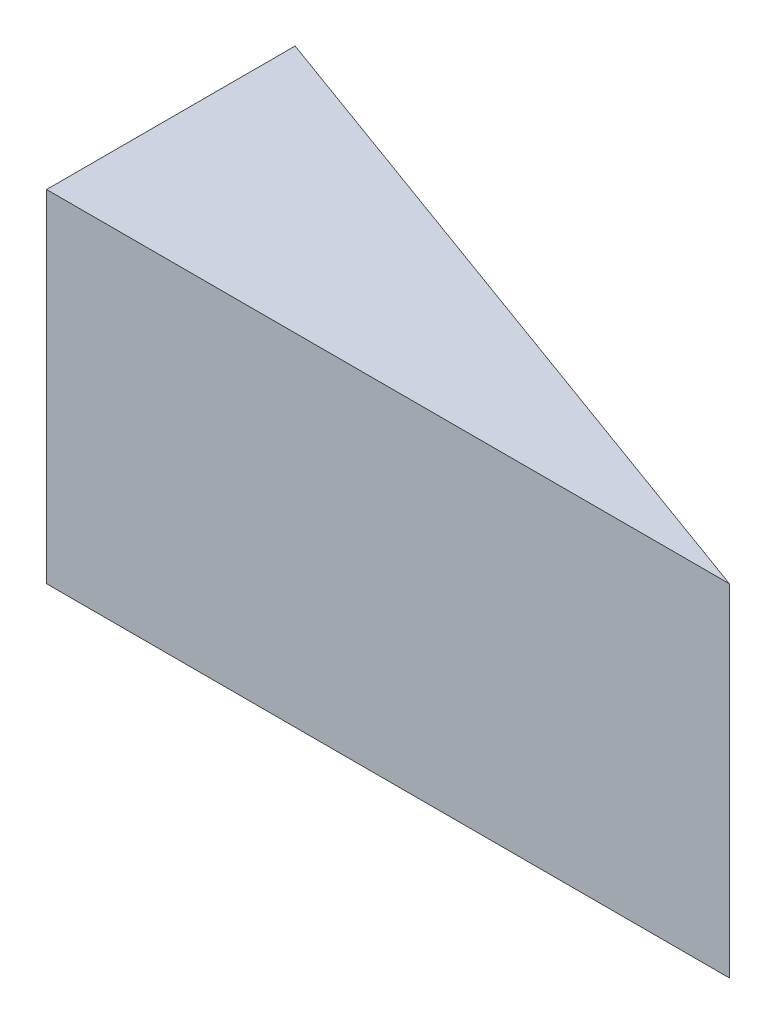
ISO-10303-21;
HEADER;
FILE_DESCRIPTION(('STEP AP214'),'2;1');
FILE_NAME('part.step','',(''),(''),'','','');
FILE_SCHEMA(('AUTOMOTIVE_DESIGN { 1 0 10303 214 1 1 1 1 }'));
ENDSEC;
DATA;
#1=APPLICATION_CONTEXT('core data for automotive mechanical design processes');
#2=APPLICATION_PROTOCOL_DEFINITION('international standard','automotive_design',2000,#1);
#3=PRODUCT_CONTEXT('',#1,'mechanical');
#4=PRODUCT('Part','Part','',(#3));
#5=PRODUCT_RELATED_PRODUCT_CATEGORY('part','',(#4));
#6=PRODUCT_DEFINITION_FORMATION('','',#4);
#7=PRODUCT_DEFINITION_CONTEXT('part definition',#1,'design');
#8=PRODUCT_DEFINITION('design','',#6,#7);
#9=PRODUCT_DEFINITION_SHAPE('','',#8);
#10=(LENGTH_UNIT() NAMED_UNIT(*) SI_UNIT(.MILLI.,.METRE.));
#11=(NAMED_UNIT(*) PLANE_ANGLE_UNIT() SI_UNIT($,.RADIAN.));
#12=(NAMED_UNIT(*) SI_UNIT($,.STERADIAN.) SOLID_ANGLE_UNIT());
#13=UNCERTAINTY_MEASURE_WITH_UNIT(LENGTH_MEASURE(1.E-05),#10,'distance_accuracy_value','');
#14=(GEOMETRIC_REPRESENTATION_CONTEXT(3) GLOBAL_UNCERTAINTY_ASSIGNED_CONTEXT((#13)) GLOBAL_UNIT_ASSIGNED_CONTEXT((#10,
#11,#12)) REPRESENTATION_CONTEXT('',''));
#15=CARTESIAN_POINT('',(0.,0.,0.));
#16=DIRECTION('',(0.,0.,1.));
#17=DIRECTION('',(1.,0.,0.));
#18=AXIS2_PLACEMENT_3D('',#15,#16,#17);
#19=CARTESIAN_POINT('',(0.,20.,-14.5588093706478));
#20=DIRECTION('',(1.,0.,0.));
#21=DIRECTION('',(0.,0.,-1.));
#22=AXIS2_PLACEMENT_3D('',#19,#20,#21);
#23=PLANE('',#22);
#24=DIRECTION('',(0.,0.,1.));
#25=VECTOR('',#24,1.);
#26=CARTESIAN_POINT('',(0.,0.,-14.5588093706478));
#27=LINE('',#26,#25);
#28=CARTESIAN_POINT('',(0.,0.,-14.5588093706478));
#29=VERTEX_POINT('',#28);
#30=CARTESIAN_POINT('',(0.,0.,0.));
#31=VERTEX_POINT('',#30);
#32=EDGE_CURVE('E89',#29,#31,#27,.T.);
#33=ORIENTED_EDGE('',*,*,#32,.T.);
#34=DIRECTION('',(0.,-1.,0.));
#35=VECTOR('',#34,1.);
#36=CARTESIAN_POINT('',(0.,20.,0.));
#37=LINE('',#36,#35);
#38=CARTESIAN_POINT('',(0.,20.,0.));
#39=VERTEX_POINT('',#38);
#40=EDGE_CURVE('E11',#39,#31,#37,.T.);
#41=ORIENTED_EDGE('',*,*,#40,.F.);
#42=DIRECTION('',(0.,0.,1.));
#43=VECTOR('',#42,1.);
#44=CARTESIAN_POINT('',(0.,20.,-14.5588093706478));
#45=LINE('',#44,#43);
#46=CARTESIAN_POINT('',(0.,20.,-14.5588093706478));
#47=VERTEX_POINT('',#46);
#48=EDGE_CURVE('E81',#47,#39,#45,.T.);
#49=ORIENTED_EDGE('',*,*,#48,.F.);
#50=DIRECTION('',(0.,-1.,0.));
#51=VECTOR('',#50,1.);
#52=CARTESIAN_POINT('',(0.,20.,-14.5588093706478));
#53=LINE('',#52,#51);
#54=EDGE_CURVE('E90',#47,#29,#53,.T.);
#55=ORIENTED_EDGE('',*,*,#54,.T.);
#56=EDGE_LOOP('',(#33,#41,#49,#55));
#57=FACE_BOUND('',#56,.T.);
#58=ADVANCED_FACE('F39',(#57),#23,.F.);
#59=CARTESIAN_POINT('',(0.,20.,0.));
#60=DIRECTION('',(0.,0.,-1.));
#61=DIRECTION('',(-1.,0.,0.));
#62=AXIS2_PLACEMENT_3D('',#59,#60,#61);
#63=PLANE('',#62);
#64=DIRECTION('',(1.,0.,0.));
#65=VECTOR('',#64,1.);
#66=CARTESIAN_POINT('',(0.,0.,0.));
#67=LINE('',#66,#65);
#68=CARTESIAN_POINT('',(40.,0.,0.));
#69=VERTEX_POINT('',#68);
#70=EDGE_CURVE('E68',#31,#69,#67,.T.);
#71=ORIENTED_EDGE('',*,*,#70,.T.);
#72=DIRECTION('',(0.,-1.,0.));
#73=VECTOR('',#72,1.);
#74=CARTESIAN_POINT('',(40.,20.,0.));
#75=LINE('',#74,#73);
#76=CARTESIAN_POINT('',(40.,20.,0.));
#77=VERTEX_POINT('',#76);
#78=EDGE_CURVE('E48',#77,#69,#75,.T.);
#79=ORIENTED_EDGE('',*,*,#78,.F.);
#80=DIRECTION('',(1.,0.,0.));
#81=VECTOR('',#80,1.);
#82=CARTESIAN_POINT('',(0.,20.,0.));
#83=LINE('',#82,#81);
#84=EDGE_CURVE('E76',#39,#77,#83,.T.);
#85=ORIENTED_EDGE('',*,*,#84,.F.);
#86=ORIENTED_EDGE('',*,*,#40,.T.);
#87=EDGE_LOOP('',(#71,#79,#85,#86));
#88=FACE_BOUND('',#87,.T.);
#89=ADVANCED_FACE('F77',(#88),#63,.F.);
#90=CARTESIAN_POINT('',(40.,20.,0.));
#91=DIRECTION('',(-0.342020143325663,0.,0.93969262078591));
#92=DIRECTION('',(0.939692620785911,0.,0.342020143325663));
#93=AXIS2_PLACEMENT_3D('',#90,#91,#92);
#94=PLANE('',#93);
#95=DIRECTION('',(-0.93969262078591,0.,-0.342020143325663));
#96=VECTOR('',#95,1.);
#97=CARTESIAN_POINT('',(40.,0.,0.));
#98=LINE('',#97,#96);
#99=EDGE_CURVE('E73',#69,#29,#98,.T.);
#100=ORIENTED_EDGE('',*,*,#99,.T.);
#101=ORIENTED_EDGE('',*,*,#54,.F.);
#102=DIRECTION('',(-0.93969262078591,0.,-0.342020143325663));
#103=VECTOR('',#102,1.);
#104=CARTESIAN_POINT('',(40.,20.,0.));
#105=LINE('',#104,#103);
#106=EDGE_CURVE('E56',#77,#47,#105,.T.);
#107=ORIENTED_EDGE('',*,*,#106,.F.);
#108=ORIENTED_EDGE('',*,*,#78,.T.);
#109=EDGE_LOOP('',(#100,#101,#107,#108));
#110=FACE_BOUND('',#109,.T.);
#111=ADVANCED_FACE('F102',(#110),#94,.F.);
#112=CARTESIAN_POINT('',(0.,20.,0.));
#113=DIRECTION('',(0.,1.,0.));
#114=DIRECTION('',(0.,0.,1.));
#115=AXIS2_PLACEMENT_3D('',#112,#113,#114);
#116=PLANE('',#115);
#117=ORIENTED_EDGE('',*,*,#48,.T.);
#118=ORIENTED_EDGE('',*,*,#84,.T.);
#119=ORIENTED_EDGE('',*,*,#106,.T.);
#120=EDGE_LOOP('',(#117,#118,#119));
#121=FACE_BOUND('',#120,.T.);
#122=ADVANCED_FACE('F84',(#121),#116,.T.);
#123=CARTESIAN_POINT('',(0.,0.,0.));
#124=DIRECTION('',(0.,1.,0.));
#125=DIRECTION('',(0.,0.,1.));
#126=AXIS2_PLACEMENT_3D('',#123,#124,#125);
#127=PLANE('',#126);
#128=ORIENTED_EDGE('',*,*,#32,.F.);
#129=ORIENTED_EDGE('',*,*,#99,.F.);
#130=ORIENTED_EDGE('',*,*,#70,.F.);
#131=EDGE_LOOP('',(#128,#129,#130));
#132=FACE_BOUND('',#131,.T.);
#133=ADVANCED_FACE('F103',(#132),#127,.F.);
#134=CLOSED_SHELL('',(#58,#89,#111,#122,#133));
#135=MANIFOLD_SOLID_BREP('B2',#134);
#136=ADVANCED_BREP_SHAPE_REPRESENTATION('',(#18,#135),#14);
#137=SHAPE_DEFINITION_REPRESENTATION(#9,#136);
ENDSEC;
END-ISO-10303-21;
